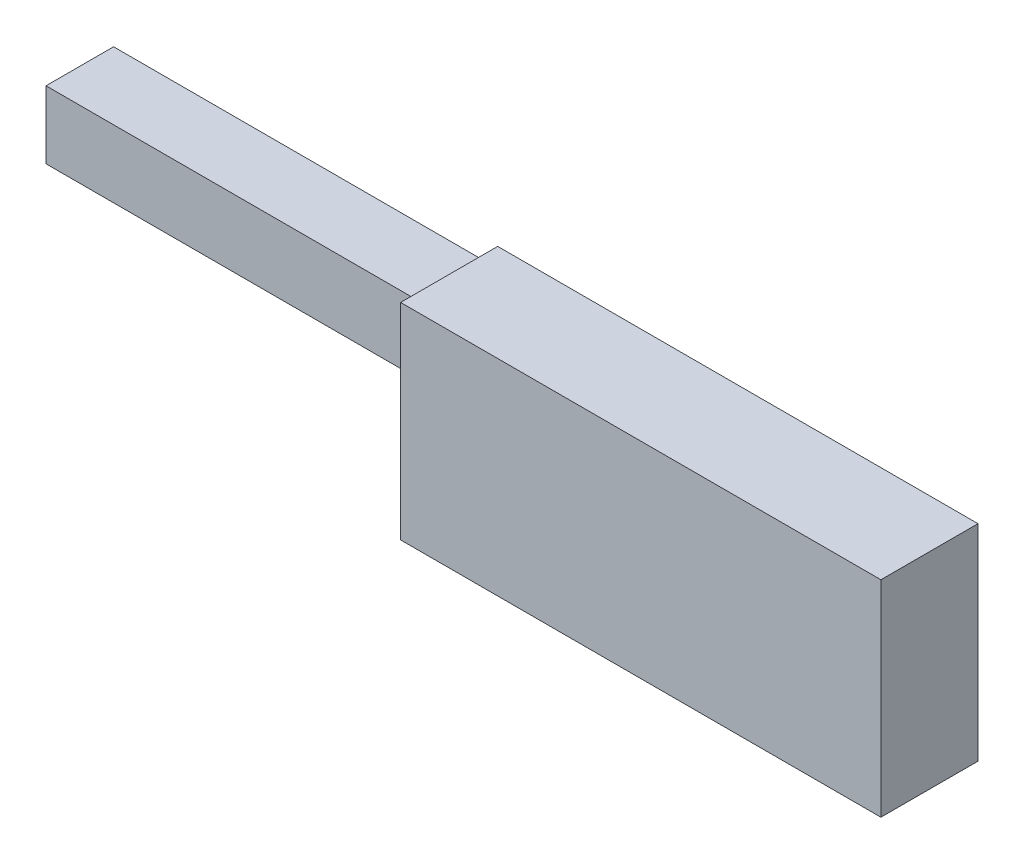
ISO-10303-21;
HEADER;
FILE_DESCRIPTION(('STEP AP214'),'2;1');
FILE_NAME('part.step','',(''),(''),'','','');
FILE_SCHEMA(('AUTOMOTIVE_DESIGN { 1 0 10303 214 1 1 1 1 }'));
ENDSEC;
DATA;
#1=APPLICATION_CONTEXT('core data for automotive mechanical design processes');
#2=APPLICATION_PROTOCOL_DEFINITION('international standard','automotive_design',2000,#1);
#3=PRODUCT_CONTEXT('',#1,'mechanical');
#4=PRODUCT('Part','Part','',(#3));
#5=PRODUCT_RELATED_PRODUCT_CATEGORY('part','',(#4));
#6=PRODUCT_DEFINITION_FORMATION('','',#4);
#7=PRODUCT_DEFINITION_CONTEXT('part definition',#1,'design');
#8=PRODUCT_DEFINITION('design','',#6,#7);
#9=PRODUCT_DEFINITION_SHAPE('','',#8);
#10=(LENGTH_UNIT() NAMED_UNIT(*) SI_UNIT(.MILLI.,.METRE.));
#11=(NAMED_UNIT(*) PLANE_ANGLE_UNIT() SI_UNIT($,.RADIAN.));
#12=(NAMED_UNIT(*) SI_UNIT($,.STERADIAN.) SOLID_ANGLE_UNIT());
#13=UNCERTAINTY_MEASURE_WITH_UNIT(LENGTH_MEASURE(1.E-05),#10,'distance_accuracy_value','');
#14=(GEOMETRIC_REPRESENTATION_CONTEXT(3) GLOBAL_UNCERTAINTY_ASSIGNED_CONTEXT((#13)) GLOBAL_UNIT_ASSIGNED_CONTEXT((#10,
#11,#12)) REPRESENTATION_CONTEXT('',''));
#15=CARTESIAN_POINT('',(0.,0.,0.));
#16=DIRECTION('',(0.,0.,1.));
#17=DIRECTION('',(1.,0.,0.));
#18=AXIS2_PLACEMENT_3D('',#15,#16,#17);
#19=CARTESIAN_POINT('',(0.,0.,8.62));
#20=DIRECTION('',(1.,0.,0.));
#21=DIRECTION('',(0.,0.,-1.));
#22=AXIS2_PLACEMENT_3D('',#19,#20,#21);
#23=PLANE('',#22);
#24=DIRECTION('',(0.,-1.,0.));
#25=VECTOR('',#24,1.);
#26=CARTESIAN_POINT('',(0.,0.,0.));
#27=LINE('',#26,#25);
#28=CARTESIAN_POINT('',(0.,18.26,0.));
#29=VERTEX_POINT('',#28);
#30=CARTESIAN_POINT('',(0.,0.,0.));
#31=VERTEX_POINT('',#30);
#32=EDGE_CURVE('E118',#29,#31,#27,.T.);
#33=ORIENTED_EDGE('',*,*,#32,.T.);
#34=DIRECTION('',(0.,0.,-1.));
#35=VECTOR('',#34,1.);
#36=CARTESIAN_POINT('',(0.,0.,8.62));
#37=LINE('',#36,#35);
#38=CARTESIAN_POINT('',(0.,0.,8.62));
#39=VERTEX_POINT('',#38);
#40=EDGE_CURVE('E11',#39,#31,#37,.T.);
#41=ORIENTED_EDGE('',*,*,#40,.F.);
#42=DIRECTION('',(0.,-1.,0.));
#43=VECTOR('',#42,1.);
#44=CARTESIAN_POINT('',(0.,0.,8.62));
#45=LINE('',#44,#43);
#46=CARTESIAN_POINT('',(0.,18.26,8.62));
#47=VERTEX_POINT('',#46);
#48=EDGE_CURVE('E127',#47,#39,#45,.T.);
#49=ORIENTED_EDGE('',*,*,#48,.F.);
#50=DIRECTION('',(0.,0.,-1.));
#51=VECTOR('',#50,1.);
#52=CARTESIAN_POINT('',(0.,18.26,8.62));
#53=LINE('',#52,#51);
#54=EDGE_CURVE('E136',#47,#29,#53,.T.);
#55=ORIENTED_EDGE('',*,*,#54,.T.);
#56=EDGE_LOOP('',(#33,#41,#49,#55));
#57=FACE_BOUND('',#56,.T.);
#58=DIRECTION('',(0.,-1.,0.));
#59=VECTOR('',#58,1.);
#60=CARTESIAN_POINT('',(0.,17.6572712987597,1.09975880158227));
#61=LINE('',#60,#59);
#62=CARTESIAN_POINT('',(0.,17.6572712987597,1.09975880158227));
#63=VERTEX_POINT('',#62);
#64=CARTESIAN_POINT('',(0.,11.6572712987597,1.09975880158227));
#65=VERTEX_POINT('',#64);
#66=EDGE_CURVE('E117',#63,#65,#61,.T.);
#67=ORIENTED_EDGE('',*,*,#66,.F.);
#68=DIRECTION('',(0.,0.,-1.));
#69=VECTOR('',#68,1.);
#70=CARTESIAN_POINT('',(0.,17.6572712987597,1.09975880158227));
#71=LINE('',#70,#69);
#72=CARTESIAN_POINT('',(0.,17.6572712987597,7.09975880158227));
#73=VERTEX_POINT('',#72);
#74=EDGE_CURVE('E114',#73,#63,#71,.T.);
#75=ORIENTED_EDGE('',*,*,#74,.F.);
#76=DIRECTION('',(0.,1.,0.));
#77=VECTOR('',#76,1.);
#78=CARTESIAN_POINT('',(0.,17.6572712987597,7.09975880158227));
#79=LINE('',#78,#77);
#80=CARTESIAN_POINT('',(0.,11.6572712987597,7.09975880158227));
#81=VERTEX_POINT('',#80);
#82=EDGE_CURVE('E52',#81,#73,#79,.T.);
#83=ORIENTED_EDGE('',*,*,#82,.F.);
#84=DIRECTION('',(0.,0.,1.));
#85=VECTOR('',#84,1.);
#86=CARTESIAN_POINT('',(0.,11.6572712987597,1.09975880158227));
#87=LINE('',#86,#85);
#88=EDGE_CURVE('E47',#65,#81,#87,.T.);
#89=ORIENTED_EDGE('',*,*,#88,.F.);
#90=EDGE_LOOP('',(#67,#75,#83,#89));
#91=FACE_BOUND('',#90,.T.);
#92=ADVANCED_FACE('F33',(#57,#91),#23,.F.);
#93=CARTESIAN_POINT('',(0.,0.,8.62));
#94=DIRECTION('',(0.,1.,0.));
#95=DIRECTION('',(0.,0.,1.));
#96=AXIS2_PLACEMENT_3D('',#93,#94,#95);
#97=PLANE('',#96);
#98=DIRECTION('',(1.,0.,0.));
#99=VECTOR('',#98,1.);
#100=CARTESIAN_POINT('',(0.,0.,0.));
#101=LINE('',#100,#99);
#102=CARTESIAN_POINT('',(42.64,0.,0.));
#103=VERTEX_POINT('',#102);
#104=EDGE_CURVE('E121',#31,#103,#101,.T.);
#105=ORIENTED_EDGE('',*,*,#104,.T.);
#106=DIRECTION('',(0.,0.,-1.));
#107=VECTOR('',#106,1.);
#108=CARTESIAN_POINT('',(42.64,0.,8.62));
#109=LINE('',#108,#107);
#110=CARTESIAN_POINT('',(42.64,0.,8.62));
#111=VERTEX_POINT('',#110);
#112=EDGE_CURVE('E40',#111,#103,#109,.T.);
#113=ORIENTED_EDGE('',*,*,#112,.F.);
#114=DIRECTION('',(1.,0.,0.));
#115=VECTOR('',#114,1.);
#116=CARTESIAN_POINT('',(0.,0.,8.62));
#117=LINE('',#116,#115);
#118=EDGE_CURVE('E130',#39,#111,#117,.T.);
#119=ORIENTED_EDGE('',*,*,#118,.F.);
#120=ORIENTED_EDGE('',*,*,#40,.T.);
#121=EDGE_LOOP('',(#105,#113,#119,#120));
#122=FACE_BOUND('',#121,.T.);
#123=ADVANCED_FACE('F167',(#122),#97,.F.);
#124=CARTESIAN_POINT('',(42.64,0.,8.62));
#125=DIRECTION('',(-1.,0.,0.));
#126=DIRECTION('',(0.,0.,1.));
#127=AXIS2_PLACEMENT_3D('',#124,#125,#126);
#128=PLANE('',#127);
#129=DIRECTION('',(0.,1.,0.));
#130=VECTOR('',#129,1.);
#131=CARTESIAN_POINT('',(42.64,0.,0.));
#132=LINE('',#131,#130);
#133=CARTESIAN_POINT('',(42.64,18.26,0.));
#134=VERTEX_POINT('',#133);
#135=EDGE_CURVE('E139',#103,#134,#132,.T.);
#136=ORIENTED_EDGE('',*,*,#135,.T.);
#137=DIRECTION('',(0.,0.,-1.));
#138=VECTOR('',#137,1.);
#139=CARTESIAN_POINT('',(42.64,18.26,8.62));
#140=LINE('',#139,#138);
#141=CARTESIAN_POINT('',(42.64,18.26,8.62));
#142=VERTEX_POINT('',#141);
#143=EDGE_CURVE('E144',#142,#134,#140,.T.);
#144=ORIENTED_EDGE('',*,*,#143,.F.);
#145=DIRECTION('',(0.,1.,0.));
#146=VECTOR('',#145,1.);
#147=CARTESIAN_POINT('',(42.64,0.,8.62));
#148=LINE('',#147,#146);
#149=EDGE_CURVE('E133',#111,#142,#148,.T.);
#150=ORIENTED_EDGE('',*,*,#149,.F.);
#151=ORIENTED_EDGE('',*,*,#112,.T.);
#152=EDGE_LOOP('',(#136,#144,#150,#151));
#153=FACE_BOUND('',#152,.T.);
#154=ADVANCED_FACE('F151',(#153),#128,.F.);
#155=CARTESIAN_POINT('',(0.,18.26,8.62));
#156=DIRECTION('',(0.,-1.,0.));
#157=DIRECTION('',(0.,0.,-1.));
#158=AXIS2_PLACEMENT_3D('',#155,#156,#157);
#159=PLANE('',#158);
#160=DIRECTION('',(-1.,0.,0.));
#161=VECTOR('',#160,1.);
#162=CARTESIAN_POINT('',(0.,18.26,0.));
#163=LINE('',#162,#161);
#164=EDGE_CURVE('E131',#134,#29,#163,.T.);
#165=ORIENTED_EDGE('',*,*,#164,.T.);
#166=ORIENTED_EDGE('',*,*,#54,.F.);
#167=DIRECTION('',(-1.,0.,0.));
#168=VECTOR('',#167,1.);
#169=CARTESIAN_POINT('',(0.,18.26,8.62));
#170=LINE('',#169,#168);
#171=EDGE_CURVE('E135',#142,#47,#170,.T.);
#172=ORIENTED_EDGE('',*,*,#171,.F.);
#173=ORIENTED_EDGE('',*,*,#143,.T.);
#174=EDGE_LOOP('',(#165,#166,#172,#173));
#175=FACE_BOUND('',#174,.T.);
#176=ADVANCED_FACE('F160',(#175),#159,.F.);
#177=CARTESIAN_POINT('',(0.,0.,8.62));
#178=DIRECTION('',(0.,0.,-1.));
#179=DIRECTION('',(-1.,0.,0.));
#180=AXIS2_PLACEMENT_3D('',#177,#178,#179);
#181=PLANE('',#180);
#182=ORIENTED_EDGE('',*,*,#48,.T.);
#183=ORIENTED_EDGE('',*,*,#118,.T.);
#184=ORIENTED_EDGE('',*,*,#149,.T.);
#185=ORIENTED_EDGE('',*,*,#171,.T.);
#186=EDGE_LOOP('',(#182,#183,#184,#185));
#187=FACE_BOUND('',#186,.T.);
#188=ADVANCED_FACE('F166',(#187),#181,.F.);
#189=CARTESIAN_POINT('',(0.,0.,0.));
#190=DIRECTION('',(0.,0.,-1.));
#191=DIRECTION('',(-1.,0.,0.));
#192=AXIS2_PLACEMENT_3D('',#189,#190,#191);
#193=PLANE('',#192);
#194=ORIENTED_EDGE('',*,*,#32,.F.);
#195=ORIENTED_EDGE('',*,*,#164,.F.);
#196=ORIENTED_EDGE('',*,*,#135,.F.);
#197=ORIENTED_EDGE('',*,*,#104,.F.);
#198=EDGE_LOOP('',(#194,#195,#196,#197));
#199=FACE_BOUND('',#198,.T.);
#200=ADVANCED_FACE('F157',(#199),#193,.T.);
#201=CARTESIAN_POINT('',(-33.,17.6572712987597,1.09975880158227));
#202=DIRECTION('',(0.,0.,1.));
#203=DIRECTION('',(0.,-1.,0.));
#204=AXIS2_PLACEMENT_3D('',#201,#202,#203);
#205=PLANE('',#204);
#206=ORIENTED_EDGE('',*,*,#66,.T.);
#207=DIRECTION('',(1.,0.,0.));
#208=VECTOR('',#207,1.);
#209=CARTESIAN_POINT('',(-33.,11.6572712987597,1.09975880158227));
#210=LINE('',#209,#208);
#211=CARTESIAN_POINT('',(-33.,11.6572712987597,1.09975880158227));
#212=VERTEX_POINT('',#211);
#213=EDGE_CURVE('E98',#212,#65,#210,.T.);
#214=ORIENTED_EDGE('',*,*,#213,.F.);
#215=DIRECTION('',(0.,-1.,0.));
#216=VECTOR('',#215,1.);
#217=CARTESIAN_POINT('',(-33.,17.6572712987597,1.09975880158227));
#218=LINE('',#217,#216);
#219=CARTESIAN_POINT('',(-33.,17.6572712987597,1.09975880158227));
#220=VERTEX_POINT('',#219);
#221=EDGE_CURVE('E105',#220,#212,#218,.T.);
#222=ORIENTED_EDGE('',*,*,#221,.F.);
#223=DIRECTION('',(1.,0.,0.));
#224=VECTOR('',#223,1.);
#225=CARTESIAN_POINT('',(-33.,17.6572712987597,1.09975880158227));
#226=LINE('',#225,#224);
#227=EDGE_CURVE('E260',#220,#63,#226,.T.);
#228=ORIENTED_EDGE('',*,*,#227,.T.);
#229=EDGE_LOOP('',(#206,#214,#222,#228));
#230=FACE_BOUND('',#229,.T.);
#231=ADVANCED_FACE('F116',(#230),#205,.F.);
#232=CARTESIAN_POINT('',(-33.,11.6572712987597,1.09975880158227));
#233=DIRECTION('',(0.,1.,0.));
#234=DIRECTION('',(0.,0.,1.));
#235=AXIS2_PLACEMENT_3D('',#232,#233,#234);
#236=PLANE('',#235);
#237=ORIENTED_EDGE('',*,*,#88,.T.);
#238=DIRECTION('',(1.,0.,0.));
#239=VECTOR('',#238,1.);
#240=CARTESIAN_POINT('',(-33.,11.6572712987597,7.09975880158227));
#241=LINE('',#240,#239);
#242=CARTESIAN_POINT('',(-33.,11.6572712987597,7.09975880158227));
#243=VERTEX_POINT('',#242);
#244=EDGE_CURVE('E101',#243,#81,#241,.T.);
#245=ORIENTED_EDGE('',*,*,#244,.F.);
#246=DIRECTION('',(0.,0.,1.));
#247=VECTOR('',#246,1.);
#248=CARTESIAN_POINT('',(-33.,11.6572712987597,1.09975880158227));
#249=LINE('',#248,#247);
#250=EDGE_CURVE('E94',#212,#243,#249,.T.);
#251=ORIENTED_EDGE('',*,*,#250,.F.);
#252=ORIENTED_EDGE('',*,*,#213,.T.);
#253=EDGE_LOOP('',(#237,#245,#251,#252));
#254=FACE_BOUND('',#253,.T.);
#255=ADVANCED_FACE('F96',(#254),#236,.F.);
#256=CARTESIAN_POINT('',(-33.,17.6572712987597,7.09975880158227));
#257=DIRECTION('',(0.,0.,-1.));
#258=DIRECTION('',(-1.,0.,0.));
#259=AXIS2_PLACEMENT_3D('',#256,#257,#258);
#260=PLANE('',#259);
#261=ORIENTED_EDGE('',*,*,#82,.T.);
#262=DIRECTION('',(1.,0.,0.));
#263=VECTOR('',#262,1.);
#264=CARTESIAN_POINT('',(-33.,17.6572712987597,7.09975880158227));
#265=LINE('',#264,#263);
#266=CARTESIAN_POINT('',(-33.,17.6572712987597,7.09975880158227));
#267=VERTEX_POINT('',#266);
#268=EDGE_CURVE('E123',#267,#73,#265,.T.);
#269=ORIENTED_EDGE('',*,*,#268,.F.);
#270=DIRECTION('',(0.,1.,0.));
#271=VECTOR('',#270,1.);
#272=CARTESIAN_POINT('',(-33.,17.6572712987597,7.09975880158227));
#273=LINE('',#272,#271);
#274=EDGE_CURVE('E104',#243,#267,#273,.T.);
#275=ORIENTED_EDGE('',*,*,#274,.F.);
#276=ORIENTED_EDGE('',*,*,#244,.T.);
#277=EDGE_LOOP('',(#261,#269,#275,#276));
#278=FACE_BOUND('',#277,.T.);
#279=ADVANCED_FACE('F185',(#278),#260,.F.);
#280=CARTESIAN_POINT('',(-33.,17.6572712987597,1.09975880158227));
#281=DIRECTION('',(0.,-1.,0.));
#282=DIRECTION('',(0.,0.,-1.));
#283=AXIS2_PLACEMENT_3D('',#280,#281,#282);
#284=PLANE('',#283);
#285=ORIENTED_EDGE('',*,*,#74,.T.);
#286=ORIENTED_EDGE('',*,*,#227,.F.);
#287=DIRECTION('',(0.,0.,-1.));
#288=VECTOR('',#287,1.);
#289=CARTESIAN_POINT('',(-33.,17.6572712987597,1.09975880158227));
#290=LINE('',#289,#288);
#291=EDGE_CURVE('E110',#267,#220,#290,.T.);
#292=ORIENTED_EDGE('',*,*,#291,.F.);
#293=ORIENTED_EDGE('',*,*,#268,.T.);
#294=EDGE_LOOP('',(#285,#286,#292,#293));
#295=FACE_BOUND('',#294,.T.);
#296=ADVANCED_FACE('F188',(#295),#284,.F.);
#297=CARTESIAN_POINT('',(-33.,0.,0.));
#298=DIRECTION('',(-1.,0.,0.));
#299=DIRECTION('',(0.,0.,1.));
#300=AXIS2_PLACEMENT_3D('',#297,#298,#299);
#301=PLANE('',#300);
#302=ORIENTED_EDGE('',*,*,#221,.T.);
#303=ORIENTED_EDGE('',*,*,#250,.T.);
#304=ORIENTED_EDGE('',*,*,#274,.T.);
#305=ORIENTED_EDGE('',*,*,#291,.T.);
#306=EDGE_LOOP('',(#302,#303,#304,#305));
#307=FACE_BOUND('',#306,.T.);
#308=ADVANCED_FACE('F108',(#307),#301,.T.);
#309=CLOSED_SHELL('',(#92,#123,#154,#176,#188,#200,#231,#255,#279,#296,#308));
#310=MANIFOLD_SOLID_BREP('B2',#309);
#311=ADVANCED_BREP_SHAPE_REPRESENTATION('',(#18,#310),#14);
#312=SHAPE_DEFINITION_REPRESENTATION(#9,#311);
ENDSEC;
END-ISO-10303-21;
